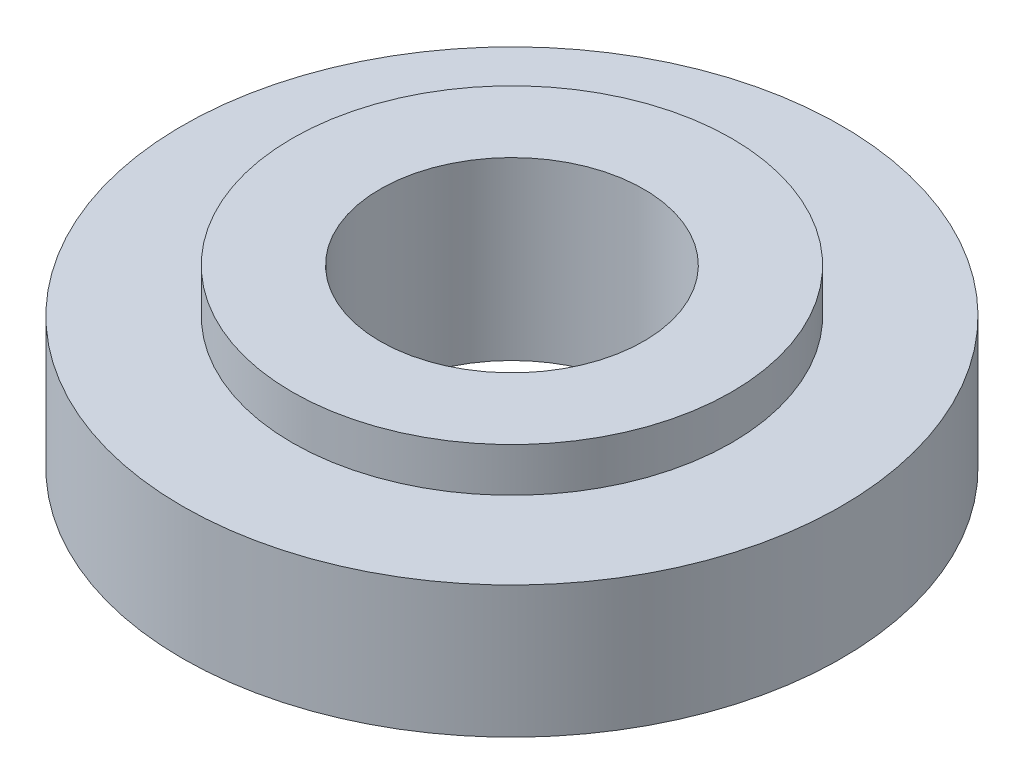
ISO-10303-21;
HEADER;
FILE_DESCRIPTION(('STEP AP214'),'2;1');
FILE_NAME('part.step','',(''),(''),'','','');
FILE_SCHEMA(('AUTOMOTIVE_DESIGN { 1 0 10303 214 1 1 1 1 }'));
ENDSEC;
DATA;
#1=APPLICATION_CONTEXT('core data for automotive mechanical design processes');
#2=APPLICATION_PROTOCOL_DEFINITION('international standard','automotive_design',2000,#1);
#3=PRODUCT_CONTEXT('',#1,'mechanical');
#4=PRODUCT('Part','Part','',(#3));
#5=PRODUCT_RELATED_PRODUCT_CATEGORY('part','',(#4));
#6=PRODUCT_DEFINITION_FORMATION('','',#4);
#7=PRODUCT_DEFINITION_CONTEXT('part definition',#1,'design');
#8=PRODUCT_DEFINITION('design','',#6,#7);
#9=PRODUCT_DEFINITION_SHAPE('','',#8);
#10=(LENGTH_UNIT() NAMED_UNIT(*) SI_UNIT(.MILLI.,.METRE.));
#11=(NAMED_UNIT(*) PLANE_ANGLE_UNIT() SI_UNIT($,.RADIAN.));
#12=(NAMED_UNIT(*) SI_UNIT($,.STERADIAN.) SOLID_ANGLE_UNIT());
#13=UNCERTAINTY_MEASURE_WITH_UNIT(LENGTH_MEASURE(1.E-05),#10,'distance_accuracy_value','');
#14=(GEOMETRIC_REPRESENTATION_CONTEXT(3) GLOBAL_UNCERTAINTY_ASSIGNED_CONTEXT((#13)) GLOBAL_UNIT_ASSIGNED_CONTEXT((#10,
#11,#12)) REPRESENTATION_CONTEXT('',''));
#15=CARTESIAN_POINT('',(0.,0.,0.));
#16=DIRECTION('',(0.,0.,1.));
#17=DIRECTION('',(1.,0.,0.));
#18=AXIS2_PLACEMENT_3D('',#15,#16,#17);
#19=CARTESIAN_POINT('',(0.,-1.5,0.));
#20=DIRECTION('',(0.,1.,0.));
#21=DIRECTION('',(0.,0.,1.));
#22=AXIS2_PLACEMENT_3D('',#19,#20,#21);
#23=CYLINDRICAL_SURFACE('',#22,3.75);
#24=CARTESIAN_POINT('',(0.,-1.5,0.));
#25=DIRECTION('',(0.,1.,0.));
#26=DIRECTION('',(0.,0.,1.));
#27=AXIS2_PLACEMENT_3D('',#24,#25,#26);
#28=CIRCLE('',#27,3.75);
#29=CARTESIAN_POINT('',(0.,-1.5,3.75));
#30=VERTEX_POINT('',#29);
#31=EDGE_CURVE('E51',#30,#30,#28,.T.);
#32=ORIENTED_EDGE('',*,*,#31,.T.);
#33=EDGE_LOOP('',(#32));
#34=FACE_BOUND('',#33,.T.);
#35=CARTESIAN_POINT('',(0.,0.,0.));
#36=DIRECTION('',(0.,1.,0.));
#37=DIRECTION('',(0.,0.,1.));
#38=AXIS2_PLACEMENT_3D('',#35,#36,#37);
#39=CIRCLE('',#38,3.75);
#40=CARTESIAN_POINT('',(0.,0.,3.75));
#41=VERTEX_POINT('',#40);
#42=EDGE_CURVE('E46',#41,#41,#39,.T.);
#43=ORIENTED_EDGE('',*,*,#42,.F.);
#44=EDGE_LOOP('',(#43));
#45=FACE_BOUND('',#44,.T.);
#46=ADVANCED_FACE('F43',(#34,#45),#23,.T.);
#47=CARTESIAN_POINT('',(0.,-1.5,0.));
#48=DIRECTION('',(0.,1.,0.));
#49=DIRECTION('',(0.,0.,1.));
#50=AXIS2_PLACEMENT_3D('',#47,#48,#49);
#51=CYLINDRICAL_SURFACE('',#50,1.5);
#52=CARTESIAN_POINT('',(0.,-1.5,0.));
#53=DIRECTION('',(0.,1.,0.));
#54=DIRECTION('',(0.,0.,1.));
#55=AXIS2_PLACEMENT_3D('',#52,#53,#54);
#56=CIRCLE('',#55,1.5);
#57=CARTESIAN_POINT('',(0.,-1.5,1.5));
#58=VERTEX_POINT('',#57);
#59=EDGE_CURVE('E10',#58,#58,#56,.T.);
#60=ORIENTED_EDGE('',*,*,#59,.F.);
#61=EDGE_LOOP('',(#60));
#62=FACE_BOUND('',#61,.T.);
#63=CARTESIAN_POINT('',(0.,0.5,0.));
#64=DIRECTION('',(0.,1.,0.));
#65=DIRECTION('',(0.,0.,1.));
#66=AXIS2_PLACEMENT_3D('',#63,#64,#65);
#67=CIRCLE('',#66,1.5);
#68=CARTESIAN_POINT('',(0.,0.5,1.5));
#69=VERTEX_POINT('',#68);
#70=EDGE_CURVE('E62',#69,#69,#67,.T.);
#71=ORIENTED_EDGE('',*,*,#70,.T.);
#72=EDGE_LOOP('',(#71));
#73=FACE_BOUND('',#72,.T.);
#74=ADVANCED_FACE('F71',(#62,#73),#51,.F.);
#75=CARTESIAN_POINT('',(0.,-1.5,0.));
#76=DIRECTION('',(0.,1.,0.));
#77=DIRECTION('',(0.,0.,1.));
#78=AXIS2_PLACEMENT_3D('',#75,#76,#77);
#79=PLANE('',#78);
#80=ORIENTED_EDGE('',*,*,#31,.F.);
#81=EDGE_LOOP('',(#80));
#82=FACE_BOUND('',#81,.T.);
#83=ORIENTED_EDGE('',*,*,#59,.T.);
#84=EDGE_LOOP('',(#83));
#85=FACE_BOUND('',#84,.T.);
#86=ADVANCED_FACE('F88',(#82,#85),#79,.F.);
#87=CARTESIAN_POINT('',(0.,0.,0.));
#88=DIRECTION('',(0.,1.,0.));
#89=DIRECTION('',(0.,0.,1.));
#90=AXIS2_PLACEMENT_3D('',#87,#88,#89);
#91=PLANE('',#90);
#92=CARTESIAN_POINT('',(0.,0.,0.));
#93=DIRECTION('',(0.,1.,0.));
#94=DIRECTION('',(0.,0.,1.));
#95=AXIS2_PLACEMENT_3D('',#92,#93,#94);
#96=CIRCLE('',#95,2.5);
#97=CARTESIAN_POINT('',(0.,0.,2.5));
#98=VERTEX_POINT('',#97);
#99=EDGE_CURVE('E58',#98,#98,#96,.T.);
#100=ORIENTED_EDGE('',*,*,#99,.F.);
#101=EDGE_LOOP('',(#100));
#102=FACE_BOUND('',#101,.T.);
#103=ORIENTED_EDGE('',*,*,#42,.T.);
#104=EDGE_LOOP('',(#103));
#105=FACE_BOUND('',#104,.T.);
#106=ADVANCED_FACE('F82',(#102,#105),#91,.T.);
#107=CARTESIAN_POINT('',(0.,0.5,0.));
#108=DIRECTION('',(0.,-1.,0.));
#109=DIRECTION('',(0.,0.,-1.));
#110=AXIS2_PLACEMENT_3D('',#107,#108,#109);
#111=CYLINDRICAL_SURFACE('',#110,2.5);
#112=CARTESIAN_POINT('',(0.,0.5,0.));
#113=DIRECTION('',(0.,1.,0.));
#114=DIRECTION('',(0.,0.,1.));
#115=AXIS2_PLACEMENT_3D('',#112,#113,#114);
#116=CIRCLE('',#115,2.5);
#117=CARTESIAN_POINT('',(0.,0.5,2.5));
#118=VERTEX_POINT('',#117);
#119=EDGE_CURVE('E63',#118,#118,#116,.T.);
#120=ORIENTED_EDGE('',*,*,#119,.F.);
#121=EDGE_LOOP('',(#120));
#122=FACE_BOUND('',#121,.T.);
#123=ORIENTED_EDGE('',*,*,#99,.T.);
#124=EDGE_LOOP('',(#123));
#125=FACE_BOUND('',#124,.T.);
#126=ADVANCED_FACE('F76',(#122,#125),#111,.T.);
#127=CARTESIAN_POINT('',(0.,0.5,0.));
#128=DIRECTION('',(0.,1.,0.));
#129=DIRECTION('',(0.,0.,1.));
#130=AXIS2_PLACEMENT_3D('',#127,#128,#129);
#131=PLANE('',#130);
#132=ORIENTED_EDGE('',*,*,#70,.F.);
#133=EDGE_LOOP('',(#132));
#134=FACE_BOUND('',#133,.T.);
#135=ORIENTED_EDGE('',*,*,#119,.T.);
#136=EDGE_LOOP('',(#135));
#137=FACE_BOUND('',#136,.T.);
#138=ADVANCED_FACE('F73',(#134,#137),#131,.T.);
#139=CLOSED_SHELL('',(#46,#74,#86,#106,#126,#138));
#140=MANIFOLD_SOLID_BREP('B2',#139);
#141=ADVANCED_BREP_SHAPE_REPRESENTATION('',(#18,#140),#14);
#142=SHAPE_DEFINITION_REPRESENTATION(#9,#141);
ENDSEC;
END-ISO-10303-21;
